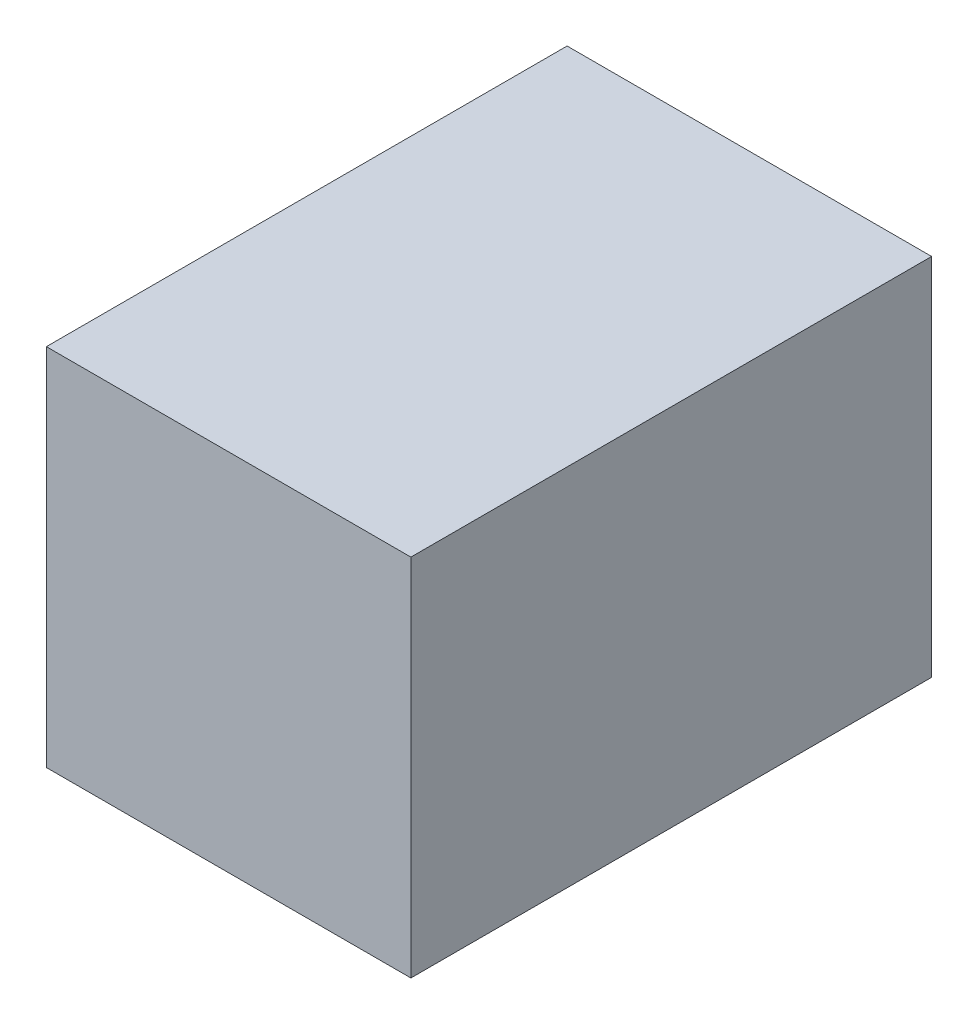
ISO-10303-21;
HEADER;
FILE_DESCRIPTION(('STEP AP214'),'2;1');
FILE_NAME('part.step','',(''),(''),'','','');
FILE_SCHEMA(('AUTOMOTIVE_DESIGN { 1 0 10303 214 1 1 1 1 }'));
ENDSEC;
DATA;
#1=APPLICATION_CONTEXT('core data for automotive mechanical design processes');
#2=APPLICATION_PROTOCOL_DEFINITION('international standard','automotive_design',2000,#1);
#3=PRODUCT_CONTEXT('',#1,'mechanical');
#4=PRODUCT('Part','Part','',(#3));
#5=PRODUCT_RELATED_PRODUCT_CATEGORY('part','',(#4));
#6=PRODUCT_DEFINITION_FORMATION('','',#4);
#7=PRODUCT_DEFINITION_CONTEXT('part definition',#1,'design');
#8=PRODUCT_DEFINITION('design','',#6,#7);
#9=PRODUCT_DEFINITION_SHAPE('','',#8);
#10=(LENGTH_UNIT() NAMED_UNIT(*) SI_UNIT(.MILLI.,.METRE.));
#11=(NAMED_UNIT(*) PLANE_ANGLE_UNIT() SI_UNIT($,.RADIAN.));
#12=(NAMED_UNIT(*) SI_UNIT($,.STERADIAN.) SOLID_ANGLE_UNIT());
#13=UNCERTAINTY_MEASURE_WITH_UNIT(LENGTH_MEASURE(1.E-05),#10,'distance_accuracy_value','');
#14=(GEOMETRIC_REPRESENTATION_CONTEXT(3) GLOBAL_UNCERTAINTY_ASSIGNED_CONTEXT((#13)) GLOBAL_UNIT_ASSIGNED_CONTEXT((#10,
#11,#12)) REPRESENTATION_CONTEXT('',''));
#15=CARTESIAN_POINT('',(0.,0.,0.));
#16=DIRECTION('',(0.,0.,1.));
#17=DIRECTION('',(1.,0.,0.));
#18=AXIS2_PLACEMENT_3D('',#15,#16,#17);
#19=CARTESIAN_POINT('',(17.5,17.5,50.));
#20=DIRECTION('',(-1.,0.,0.));
#21=DIRECTION('',(0.,-1.,0.));
#22=AXIS2_PLACEMENT_3D('',#19,#20,#21);
#23=PLANE('',#22);
#24=DIRECTION('',(0.,1.,0.));
#25=VECTOR('',#24,1.);
#26=CARTESIAN_POINT('',(17.5,17.5,0.));
#27=LINE('',#26,#25);
#28=CARTESIAN_POINT('',(17.5,-17.5,0.));
#29=VERTEX_POINT('',#28);
#30=CARTESIAN_POINT('',(17.5,17.5,0.));
#31=VERTEX_POINT('',#30);
#32=EDGE_CURVE('E140',#29,#31,#27,.T.);
#33=ORIENTED_EDGE('',*,*,#32,.T.);
#34=DIRECTION('',(0.,0.,-1.));
#35=VECTOR('',#34,1.);
#36=CARTESIAN_POINT('',(17.5,17.5,50.));
#37=LINE('',#36,#35);
#38=CARTESIAN_POINT('',(17.5,17.5,50.));
#39=VERTEX_POINT('',#38);
#40=EDGE_CURVE('E11',#39,#31,#37,.T.);
#41=ORIENTED_EDGE('',*,*,#40,.F.);
#42=DIRECTION('',(0.,1.,0.));
#43=VECTOR('',#42,1.);
#44=CARTESIAN_POINT('',(17.5,17.5,50.));
#45=LINE('',#44,#43);
#46=CARTESIAN_POINT('',(17.5,-17.5,50.));
#47=VERTEX_POINT('',#46);
#48=EDGE_CURVE('E144',#47,#39,#45,.T.);
#49=ORIENTED_EDGE('',*,*,#48,.F.);
#50=DIRECTION('',(0.,0.,-1.));
#51=VECTOR('',#50,1.);
#52=CARTESIAN_POINT('',(17.5,-17.5,50.));
#53=LINE('',#52,#51);
#54=EDGE_CURVE('E150',#47,#29,#53,.T.);
#55=ORIENTED_EDGE('',*,*,#54,.T.);
#56=EDGE_LOOP('',(#33,#41,#49,#55));
#57=FACE_BOUND('',#56,.T.);
#58=ADVANCED_FACE('F32',(#57),#23,.F.);
#59=CARTESIAN_POINT('',(-17.5,17.5,50.));
#60=DIRECTION('',(0.,-1.,0.));
#61=DIRECTION('',(0.,0.,-1.));
#62=AXIS2_PLACEMENT_3D('',#59,#60,#61);
#63=PLANE('',#62);
#64=DIRECTION('',(-1.,0.,0.));
#65=VECTOR('',#64,1.);
#66=CARTESIAN_POINT('',(-17.5,17.5,0.));
#67=LINE('',#66,#65);
#68=CARTESIAN_POINT('',(-17.5,17.5,0.));
#69=VERTEX_POINT('',#68);
#70=EDGE_CURVE('E153',#31,#69,#67,.T.);
#71=ORIENTED_EDGE('',*,*,#70,.T.);
#72=DIRECTION('',(0.,0.,-1.));
#73=VECTOR('',#72,1.);
#74=CARTESIAN_POINT('',(-17.5,17.5,50.));
#75=LINE('',#74,#73);
#76=CARTESIAN_POINT('',(-17.5,17.5,50.));
#77=VERTEX_POINT('',#76);
#78=EDGE_CURVE('E39',#77,#69,#75,.T.);
#79=ORIENTED_EDGE('',*,*,#78,.F.);
#80=DIRECTION('',(-1.,0.,0.));
#81=VECTOR('',#80,1.);
#82=CARTESIAN_POINT('',(-17.5,17.5,50.));
#83=LINE('',#82,#81);
#84=EDGE_CURVE('E83',#39,#77,#83,.T.);
#85=ORIENTED_EDGE('',*,*,#84,.F.);
#86=ORIENTED_EDGE('',*,*,#40,.T.);
#87=EDGE_LOOP('',(#71,#79,#85,#86));
#88=FACE_BOUND('',#87,.T.);
#89=ADVANCED_FACE('F181',(#88),#63,.F.);
#90=CARTESIAN_POINT('',(-17.5,17.5,50.));
#91=DIRECTION('',(1.,0.,0.));
#92=DIRECTION('',(0.,1.,0.));
#93=AXIS2_PLACEMENT_3D('',#90,#91,#92);
#94=PLANE('',#93);
#95=DIRECTION('',(0.,-1.,0.));
#96=VECTOR('',#95,1.);
#97=CARTESIAN_POINT('',(-17.5,17.5,0.));
#98=LINE('',#97,#96);
#99=CARTESIAN_POINT('',(-17.5,-17.5,0.));
#100=VERTEX_POINT('',#99);
#101=EDGE_CURVE('E155',#69,#100,#98,.T.);
#102=ORIENTED_EDGE('',*,*,#101,.T.);
#103=DIRECTION('',(0.,0.,-1.));
#104=VECTOR('',#103,1.);
#105=CARTESIAN_POINT('',(-17.5,-17.5,50.));
#106=LINE('',#105,#104);
#107=CARTESIAN_POINT('',(-17.5,-17.5,50.));
#108=VERTEX_POINT('',#107);
#109=EDGE_CURVE('E159',#108,#100,#106,.T.);
#110=ORIENTED_EDGE('',*,*,#109,.F.);
#111=DIRECTION('',(0.,-1.,0.));
#112=VECTOR('',#111,1.);
#113=CARTESIAN_POINT('',(-17.5,17.5,50.));
#114=LINE('',#113,#112);
#115=EDGE_CURVE('E147',#77,#108,#114,.T.);
#116=ORIENTED_EDGE('',*,*,#115,.F.);
#117=ORIENTED_EDGE('',*,*,#78,.T.);
#118=EDGE_LOOP('',(#102,#110,#116,#117));
#119=FACE_BOUND('',#118,.T.);
#120=ADVANCED_FACE('F164',(#119),#94,.F.);
#121=CARTESIAN_POINT('',(-17.5,-17.5,50.));
#122=DIRECTION('',(0.,1.,0.));
#123=DIRECTION('',(0.,0.,1.));
#124=AXIS2_PLACEMENT_3D('',#121,#122,#123);
#125=PLANE('',#124);
#126=DIRECTION('',(1.,0.,0.));
#127=VECTOR('',#126,1.);
#128=CARTESIAN_POINT('',(-17.5,-17.5,0.));
#129=LINE('',#128,#127);
#130=EDGE_CURVE('E76',#100,#29,#129,.T.);
#131=ORIENTED_EDGE('',*,*,#130,.T.);
#132=ORIENTED_EDGE('',*,*,#54,.F.);
#133=DIRECTION('',(1.,0.,0.));
#134=VECTOR('',#133,1.);
#135=CARTESIAN_POINT('',(-17.5,-17.5,50.));
#136=LINE('',#135,#134);
#137=EDGE_CURVE('E55',#108,#47,#136,.T.);
#138=ORIENTED_EDGE('',*,*,#137,.F.);
#139=ORIENTED_EDGE('',*,*,#109,.T.);
#140=EDGE_LOOP('',(#131,#132,#138,#139));
#141=FACE_BOUND('',#140,.T.);
#142=ADVANCED_FACE('F172',(#141),#125,.F.);
#143=CARTESIAN_POINT('',(0.,0.,50.));
#144=DIRECTION('',(0.,0.,1.));
#145=DIRECTION('',(1.,0.,0.));
#146=AXIS2_PLACEMENT_3D('',#143,#144,#145);
#147=PLANE('',#146);
#148=ORIENTED_EDGE('',*,*,#48,.T.);
#149=ORIENTED_EDGE('',*,*,#84,.T.);
#150=ORIENTED_EDGE('',*,*,#115,.T.);
#151=ORIENTED_EDGE('',*,*,#137,.T.);
#152=EDGE_LOOP('',(#148,#149,#150,#151));
#153=FACE_BOUND('',#152,.T.);
#154=ADVANCED_FACE('F174',(#153),#147,.T.);
#155=CARTESIAN_POINT('',(0.,0.,0.));
#156=DIRECTION('',(0.,0.,1.));
#157=DIRECTION('',(1.,0.,0.));
#158=AXIS2_PLACEMENT_3D('',#155,#156,#157);
#159=PLANE('',#158);
#160=DIRECTION('',(1.,0.,0.));
#161=VECTOR('',#160,1.);
#162=CARTESIAN_POINT('',(15.,15.,0.));
#163=LINE('',#162,#161);
#164=CARTESIAN_POINT('',(-15.,15.,0.));
#165=VERTEX_POINT('',#164);
#166=CARTESIAN_POINT('',(15.,15.,0.));
#167=VERTEX_POINT('',#166);
#168=EDGE_CURVE('E134',#165,#167,#163,.T.);
#169=ORIENTED_EDGE('',*,*,#168,.F.);
#170=DIRECTION('',(0.,1.,0.));
#171=VECTOR('',#170,1.);
#172=CARTESIAN_POINT('',(-15.,15.,0.));
#173=LINE('',#172,#171);
#174=CARTESIAN_POINT('',(-15.,-15.,0.));
#175=VERTEX_POINT('',#174);
#176=EDGE_CURVE('E46',#175,#165,#173,.T.);
#177=ORIENTED_EDGE('',*,*,#176,.F.);
#178=DIRECTION('',(-1.,0.,0.));
#179=VECTOR('',#178,1.);
#180=CARTESIAN_POINT('',(15.,-15.,0.));
#181=LINE('',#180,#179);
#182=CARTESIAN_POINT('',(15.,-15.,0.));
#183=VERTEX_POINT('',#182);
#184=EDGE_CURVE('E125',#183,#175,#181,.T.);
#185=ORIENTED_EDGE('',*,*,#184,.F.);
#186=DIRECTION('',(0.,-1.,0.));
#187=VECTOR('',#186,1.);
#188=CARTESIAN_POINT('',(15.,15.,0.));
#189=LINE('',#188,#187);
#190=EDGE_CURVE('E128',#167,#183,#189,.T.);
#191=ORIENTED_EDGE('',*,*,#190,.F.);
#192=EDGE_LOOP('',(#169,#177,#185,#191));
#193=FACE_BOUND('',#192,.T.);
#194=ORIENTED_EDGE('',*,*,#32,.F.);
#195=ORIENTED_EDGE('',*,*,#130,.F.);
#196=ORIENTED_EDGE('',*,*,#101,.F.);
#197=ORIENTED_EDGE('',*,*,#70,.F.);
#198=EDGE_LOOP('',(#194,#195,#196,#197));
#199=FACE_BOUND('',#198,.T.);
#200=ADVANCED_FACE('F168',(#193,#199),#159,.F.);
#201=CARTESIAN_POINT('',(-15.,15.,45.));
#202=DIRECTION('',(-1.,0.,0.));
#203=DIRECTION('',(0.,-1.,0.));
#204=AXIS2_PLACEMENT_3D('',#201,#202,#203);
#205=PLANE('',#204);
#206=ORIENTED_EDGE('',*,*,#176,.T.);
#207=DIRECTION('',(0.,0.,-1.));
#208=VECTOR('',#207,1.);
#209=CARTESIAN_POINT('',(-15.,15.,45.));
#210=LINE('',#209,#208);
#211=CARTESIAN_POINT('',(-15.,15.,45.));
#212=VERTEX_POINT('',#211);
#213=EDGE_CURVE('E103',#212,#165,#210,.T.);
#214=ORIENTED_EDGE('',*,*,#213,.F.);
#215=DIRECTION('',(0.,1.,0.));
#216=VECTOR('',#215,1.);
#217=CARTESIAN_POINT('',(-15.,15.,45.));
#218=LINE('',#217,#216);
#219=CARTESIAN_POINT('',(-15.,-15.,45.));
#220=VERTEX_POINT('',#219);
#221=EDGE_CURVE('E107',#220,#212,#218,.T.);
#222=ORIENTED_EDGE('',*,*,#221,.F.);
#223=DIRECTION('',(0.,0.,-1.));
#224=VECTOR('',#223,1.);
#225=CARTESIAN_POINT('',(-15.,-15.,45.));
#226=LINE('',#225,#224);
#227=EDGE_CURVE('E138',#220,#175,#226,.T.);
#228=ORIENTED_EDGE('',*,*,#227,.T.);
#229=EDGE_LOOP('',(#206,#214,#222,#228));
#230=FACE_BOUND('',#229,.T.);
#231=ADVANCED_FACE('F105',(#230),#205,.F.);
#232=CARTESIAN_POINT('',(15.,-15.,45.));
#233=DIRECTION('',(0.,-1.,0.));
#234=DIRECTION('',(0.,0.,-1.));
#235=AXIS2_PLACEMENT_3D('',#232,#233,#234);
#236=PLANE('',#235);
#237=ORIENTED_EDGE('',*,*,#184,.T.);
#238=ORIENTED_EDGE('',*,*,#227,.F.);
#239=DIRECTION('',(-1.,0.,0.));
#240=VECTOR('',#239,1.);
#241=CARTESIAN_POINT('',(15.,-15.,45.));
#242=LINE('',#241,#240);
#243=CARTESIAN_POINT('',(15.,-15.,45.));
#244=VERTEX_POINT('',#243);
#245=EDGE_CURVE('E113',#244,#220,#242,.T.);
#246=ORIENTED_EDGE('',*,*,#245,.F.);
#247=DIRECTION('',(0.,0.,-1.));
#248=VECTOR('',#247,1.);
#249=CARTESIAN_POINT('',(15.,-15.,45.));
#250=LINE('',#249,#248);
#251=EDGE_CURVE('E141',#244,#183,#250,.T.);
#252=ORIENTED_EDGE('',*,*,#251,.T.);
#253=EDGE_LOOP('',(#237,#238,#246,#252));
#254=FACE_BOUND('',#253,.T.);
#255=ADVANCED_FACE('F221',(#254),#236,.F.);
#256=CARTESIAN_POINT('',(15.,15.,45.));
#257=DIRECTION('',(1.,0.,0.));
#258=DIRECTION('',(0.,1.,0.));
#259=AXIS2_PLACEMENT_3D('',#256,#257,#258);
#260=PLANE('',#259);
#261=ORIENTED_EDGE('',*,*,#190,.T.);
#262=ORIENTED_EDGE('',*,*,#251,.F.);
#263=DIRECTION('',(0.,-1.,0.));
#264=VECTOR('',#263,1.);
#265=CARTESIAN_POINT('',(15.,15.,45.));
#266=LINE('',#265,#264);
#267=CARTESIAN_POINT('',(15.,15.,45.));
#268=VERTEX_POINT('',#267);
#269=EDGE_CURVE('E121',#268,#244,#266,.T.);
#270=ORIENTED_EDGE('',*,*,#269,.F.);
#271=DIRECTION('',(0.,0.,-1.));
#272=VECTOR('',#271,1.);
#273=CARTESIAN_POINT('',(15.,15.,45.));
#274=LINE('',#273,#272);
#275=EDGE_CURVE('E112',#268,#167,#274,.T.);
#276=ORIENTED_EDGE('',*,*,#275,.T.);
#277=EDGE_LOOP('',(#261,#262,#270,#276));
#278=FACE_BOUND('',#277,.T.);
#279=ADVANCED_FACE('F230',(#278),#260,.F.);
#280=CARTESIAN_POINT('',(15.,15.,45.));
#281=DIRECTION('',(0.,1.,0.));
#282=DIRECTION('',(0.,0.,1.));
#283=AXIS2_PLACEMENT_3D('',#280,#281,#282);
#284=PLANE('',#283);
#285=ORIENTED_EDGE('',*,*,#168,.T.);
#286=ORIENTED_EDGE('',*,*,#275,.F.);
#287=DIRECTION('',(1.,0.,0.));
#288=VECTOR('',#287,1.);
#289=CARTESIAN_POINT('',(15.,15.,45.));
#290=LINE('',#289,#288);
#291=EDGE_CURVE('E116',#212,#268,#290,.T.);
#292=ORIENTED_EDGE('',*,*,#291,.F.);
#293=ORIENTED_EDGE('',*,*,#213,.T.);
#294=EDGE_LOOP('',(#285,#286,#292,#293));
#295=FACE_BOUND('',#294,.T.);
#296=ADVANCED_FACE('F117',(#295),#284,.F.);
#297=CARTESIAN_POINT('',(0.,0.,45.));
#298=DIRECTION('',(0.,0.,-1.));
#299=DIRECTION('',(-1.,0.,0.));
#300=AXIS2_PLACEMENT_3D('',#297,#298,#299);
#301=PLANE('',#300);
#302=ORIENTED_EDGE('',*,*,#221,.T.);
#303=ORIENTED_EDGE('',*,*,#291,.T.);
#304=ORIENTED_EDGE('',*,*,#269,.T.);
#305=ORIENTED_EDGE('',*,*,#245,.T.);
#306=EDGE_LOOP('',(#302,#303,#304,#305));
#307=FACE_BOUND('',#306,.T.);
#308=ADVANCED_FACE('F123',(#307),#301,.T.);
#309=CLOSED_SHELL('',(#58,#89,#120,#142,#154,#200,#231,#255,#279,#296,#308));
#310=MANIFOLD_SOLID_BREP('B2',#309);
#311=ADVANCED_BREP_SHAPE_REPRESENTATION('',(#18,#310),#14);
#312=SHAPE_DEFINITION_REPRESENTATION(#9,#311);
ENDSEC;
END-ISO-10303-21;
